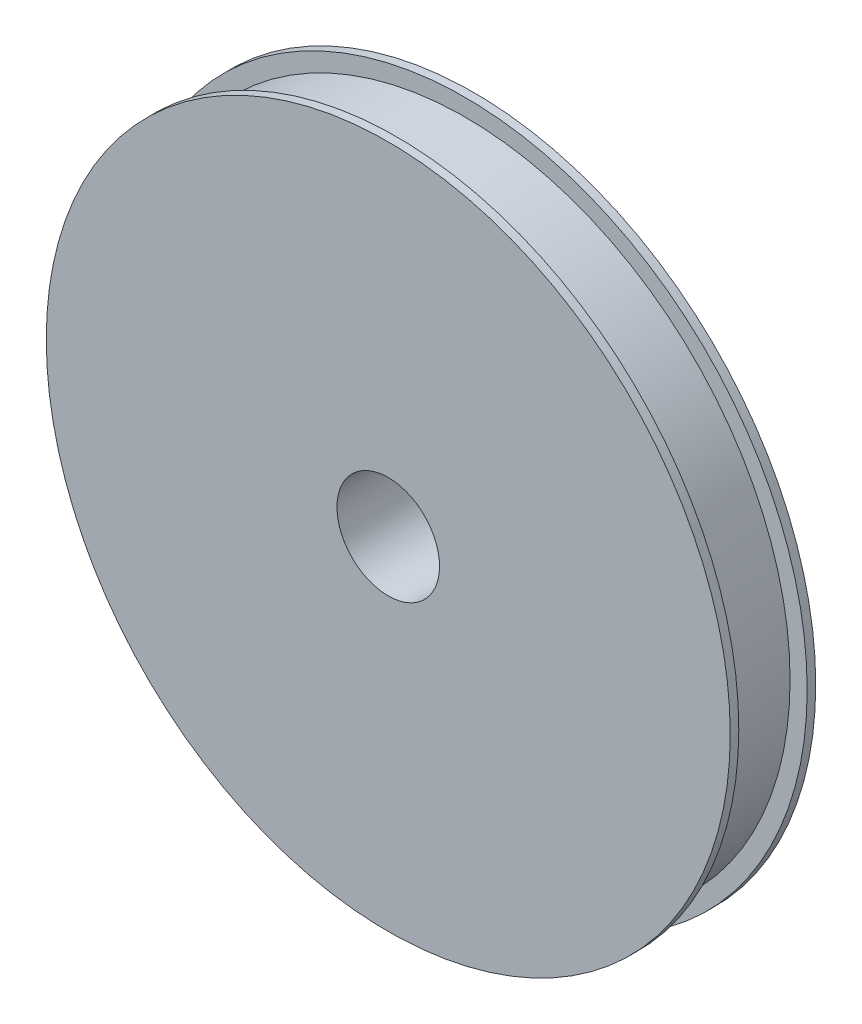
ISO-10303-21;
HEADER;
FILE_DESCRIPTION(('STEP AP214'),'2;1');
FILE_NAME('part.step','',(''),(''),'','','');
FILE_SCHEMA(('AUTOMOTIVE_DESIGN { 1 0 10303 214 1 1 1 1 }'));
ENDSEC;
DATA;
#1=APPLICATION_CONTEXT('core data for automotive mechanical design processes');
#2=APPLICATION_PROTOCOL_DEFINITION('international standard','automotive_design',2000,#1);
#3=PRODUCT_CONTEXT('',#1,'mechanical');
#4=PRODUCT('Part','Part','',(#3));
#5=PRODUCT_RELATED_PRODUCT_CATEGORY('part','',(#4));
#6=PRODUCT_DEFINITION_FORMATION('','',#4);
#7=PRODUCT_DEFINITION_CONTEXT('part definition',#1,'design');
#8=PRODUCT_DEFINITION('design','',#6,#7);
#9=PRODUCT_DEFINITION_SHAPE('','',#8);
#10=(LENGTH_UNIT() NAMED_UNIT(*) SI_UNIT(.MILLI.,.METRE.));
#11=(NAMED_UNIT(*) PLANE_ANGLE_UNIT() SI_UNIT($,.RADIAN.));
#12=(NAMED_UNIT(*) SI_UNIT($,.STERADIAN.) SOLID_ANGLE_UNIT());
#13=UNCERTAINTY_MEASURE_WITH_UNIT(LENGTH_MEASURE(1.E-05),#10,'distance_accuracy_value','');
#14=(GEOMETRIC_REPRESENTATION_CONTEXT(3) GLOBAL_UNCERTAINTY_ASSIGNED_CONTEXT((#13)) GLOBAL_UNIT_ASSIGNED_CONTEXT((#10,
#11,#12)) REPRESENTATION_CONTEXT('',''));
#15=CARTESIAN_POINT('',(0.,0.,0.));
#16=DIRECTION('',(0.,0.,1.));
#17=DIRECTION('',(1.,0.,0.));
#18=AXIS2_PLACEMENT_3D('',#15,#16,#17);
#19=CARTESIAN_POINT('',(0.,0.,10.));
#20=DIRECTION('',(0.,0.,-1.));
#21=DIRECTION('',(-1.,0.,0.));
#22=AXIS2_PLACEMENT_3D('',#19,#20,#21);
#23=CYLINDRICAL_SURFACE('',#22,40.);
#24=CARTESIAN_POINT('',(0.,0.,0.));
#25=DIRECTION('',(0.,0.,1.));
#26=DIRECTION('',(1.,0.,0.));
#27=AXIS2_PLACEMENT_3D('',#24,#25,#26);
#28=CIRCLE('',#27,40.);
#29=CARTESIAN_POINT('',(40.,0.,0.));
#30=VERTEX_POINT('',#29);
#31=EDGE_CURVE('E35',#30,#30,#28,.T.);
#32=ORIENTED_EDGE('',*,*,#31,.T.);
#33=EDGE_LOOP('',(#32));
#34=FACE_BOUND('',#33,.T.);
#35=CARTESIAN_POINT('',(0.,0.,1.));
#36=DIRECTION('',(0.,0.,1.));
#37=DIRECTION('',(1.,0.,0.));
#38=AXIS2_PLACEMENT_3D('',#35,#36,#37);
#39=CIRCLE('',#38,40.);
#40=CARTESIAN_POINT('',(40.,0.,1.));
#41=VERTEX_POINT('',#40);
#42=EDGE_CURVE('E58',#41,#41,#39,.T.);
#43=ORIENTED_EDGE('',*,*,#42,.F.);
#44=EDGE_LOOP('',(#43));
#45=FACE_BOUND('',#44,.T.);
#46=ADVANCED_FACE('F31',(#34,#45),#23,.T.);
#47=CARTESIAN_POINT('',(0.,0.,10.));
#48=DIRECTION('',(0.,0.,-1.));
#49=DIRECTION('',(-1.,0.,0.));
#50=AXIS2_PLACEMENT_3D('',#47,#48,#49);
#51=CYLINDRICAL_SURFACE('',#50,6.);
#52=CARTESIAN_POINT('',(0.,0.,10.));
#53=DIRECTION('',(0.,0.,1.));
#54=DIRECTION('',(1.,0.,0.));
#55=AXIS2_PLACEMENT_3D('',#52,#53,#54);
#56=CIRCLE('',#55,6.);
#57=CARTESIAN_POINT('',(6.,0.,10.));
#58=VERTEX_POINT('',#57);
#59=EDGE_CURVE('E39',#58,#58,#56,.T.);
#60=ORIENTED_EDGE('',*,*,#59,.T.);
#61=EDGE_LOOP('',(#60));
#62=FACE_BOUND('',#61,.T.);
#63=CARTESIAN_POINT('',(0.,0.,0.));
#64=DIRECTION('',(0.,0.,1.));
#65=DIRECTION('',(1.,0.,0.));
#66=AXIS2_PLACEMENT_3D('',#63,#64,#65);
#67=CIRCLE('',#66,6.);
#68=CARTESIAN_POINT('',(6.,0.,0.));
#69=VERTEX_POINT('',#68);
#70=EDGE_CURVE('E46',#69,#69,#67,.T.);
#71=ORIENTED_EDGE('',*,*,#70,.F.);
#72=EDGE_LOOP('',(#71));
#73=FACE_BOUND('',#72,.T.);
#74=ADVANCED_FACE('F33',(#62,#73),#51,.F.);
#75=CARTESIAN_POINT('',(0.,0.,9.));
#76=DIRECTION('',(0.,0.,1.));
#77=DIRECTION('',(1.,0.,0.));
#78=AXIS2_PLACEMENT_3D('',#75,#76,#77);
#79=CIRCLE('',#78,40.);
#80=CARTESIAN_POINT('',(40.,0.,9.));
#81=VERTEX_POINT('',#80);
#82=EDGE_CURVE('E48',#81,#81,#79,.T.);
#83=ORIENTED_EDGE('',*,*,#82,.T.);
#84=EDGE_LOOP('',(#83));
#85=FACE_BOUND('',#84,.T.);
#86=CARTESIAN_POINT('',(0.,0.,10.));
#87=DIRECTION('',(0.,0.,1.));
#88=DIRECTION('',(1.,0.,0.));
#89=AXIS2_PLACEMENT_3D('',#86,#87,#88);
#90=CIRCLE('',#89,40.);
#91=CARTESIAN_POINT('',(40.,0.,10.));
#92=VERTEX_POINT('',#91);
#93=EDGE_CURVE('E10',#92,#92,#90,.T.);
#94=ORIENTED_EDGE('',*,*,#93,.F.);
#95=EDGE_LOOP('',(#94));
#96=FACE_BOUND('',#95,.T.);
#97=ADVANCED_FACE('F70',(#85,#96),#23,.T.);
#98=CARTESIAN_POINT('',(0.,0.,10.));
#99=DIRECTION('',(0.,0.,1.));
#100=DIRECTION('',(1.,0.,0.));
#101=AXIS2_PLACEMENT_3D('',#98,#99,#100);
#102=PLANE('',#101);
#103=ORIENTED_EDGE('',*,*,#59,.F.);
#104=EDGE_LOOP('',(#103));
#105=FACE_BOUND('',#104,.T.);
#106=ORIENTED_EDGE('',*,*,#93,.T.);
#107=EDGE_LOOP('',(#106));
#108=FACE_BOUND('',#107,.T.);
#109=ADVANCED_FACE('F77',(#105,#108),#102,.T.);
#110=CARTESIAN_POINT('',(0.,0.,0.));
#111=DIRECTION('',(0.,0.,1.));
#112=DIRECTION('',(1.,0.,0.));
#113=AXIS2_PLACEMENT_3D('',#110,#111,#112);
#114=PLANE('',#113);
#115=ORIENTED_EDGE('',*,*,#70,.T.);
#116=EDGE_LOOP('',(#115));
#117=FACE_BOUND('',#116,.T.);
#118=ORIENTED_EDGE('',*,*,#31,.F.);
#119=EDGE_LOOP('',(#118));
#120=FACE_BOUND('',#119,.T.);
#121=ADVANCED_FACE('F81',(#117,#120),#114,.F.);
#122=CARTESIAN_POINT('',(0.,0.,9.));
#123=DIRECTION('',(0.,0.,-1.));
#124=DIRECTION('',(-1.,0.,0.));
#125=AXIS2_PLACEMENT_3D('',#122,#123,#124);
#126=CYLINDRICAL_SURFACE('',#125,38.);
#127=CARTESIAN_POINT('',(0.,0.,9.));
#128=DIRECTION('',(0.,0.,1.));
#129=DIRECTION('',(1.,0.,0.));
#130=AXIS2_PLACEMENT_3D('',#127,#128,#129);
#131=CIRCLE('',#130,38.);
#132=CARTESIAN_POINT('',(38.,0.,9.));
#133=VERTEX_POINT('',#132);
#134=EDGE_CURVE('E53',#133,#133,#131,.T.);
#135=ORIENTED_EDGE('',*,*,#134,.F.);
#136=EDGE_LOOP('',(#135));
#137=FACE_BOUND('',#136,.T.);
#138=CARTESIAN_POINT('',(0.,0.,1.));
#139=DIRECTION('',(0.,0.,1.));
#140=DIRECTION('',(1.,0.,0.));
#141=AXIS2_PLACEMENT_3D('',#138,#139,#140);
#142=CIRCLE('',#141,38.);
#143=CARTESIAN_POINT('',(38.,0.,1.));
#144=VERTEX_POINT('',#143);
#145=EDGE_CURVE('E61',#144,#144,#142,.T.);
#146=ORIENTED_EDGE('',*,*,#145,.T.);
#147=EDGE_LOOP('',(#146));
#148=FACE_BOUND('',#147,.T.);
#149=ADVANCED_FACE('F88',(#137,#148),#126,.T.);
#150=CARTESIAN_POINT('',(0.,0.,9.));
#151=DIRECTION('',(0.,0.,1.));
#152=DIRECTION('',(1.,0.,0.));
#153=AXIS2_PLACEMENT_3D('',#150,#151,#152);
#154=PLANE('',#153);
#155=ORIENTED_EDGE('',*,*,#134,.T.);
#156=EDGE_LOOP('',(#155));
#157=FACE_BOUND('',#156,.T.);
#158=ORIENTED_EDGE('',*,*,#82,.F.);
#159=EDGE_LOOP('',(#158));
#160=FACE_BOUND('',#159,.T.);
#161=ADVANCED_FACE('F93',(#157,#160),#154,.F.);
#162=CARTESIAN_POINT('',(0.,0.,1.));
#163=DIRECTION('',(0.,0.,1.));
#164=DIRECTION('',(1.,0.,0.));
#165=AXIS2_PLACEMENT_3D('',#162,#163,#164);
#166=PLANE('',#165);
#167=ORIENTED_EDGE('',*,*,#145,.F.);
#168=EDGE_LOOP('',(#167));
#169=FACE_BOUND('',#168,.T.);
#170=ORIENTED_EDGE('',*,*,#42,.T.);
#171=EDGE_LOOP('',(#170));
#172=FACE_BOUND('',#171,.T.);
#173=ADVANCED_FACE('F66',(#169,#172),#166,.T.);
#174=CLOSED_SHELL('',(#46,#74,#97,#109,#121,#149,#161,#173));
#175=MANIFOLD_SOLID_BREP('B2',#174);
#176=ADVANCED_BREP_SHAPE_REPRESENTATION('',(#18,#175),#14);
#177=SHAPE_DEFINITION_REPRESENTATION(#9,#176);
ENDSEC;
END-ISO-10303-21;
